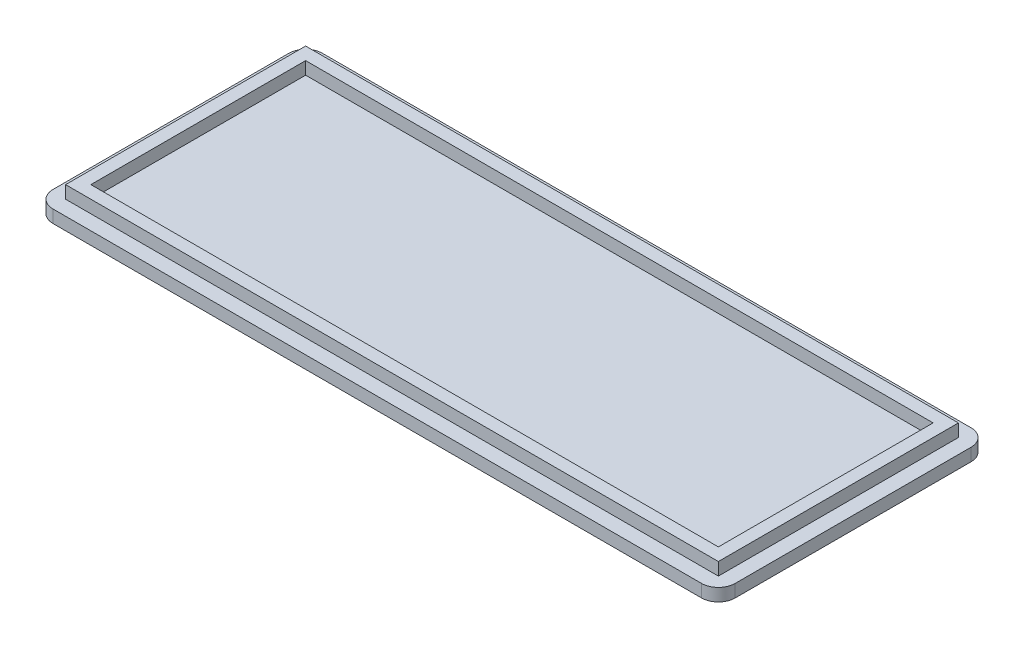
ISO-10303-21;
HEADER;
FILE_DESCRIPTION(('STEP AP214'),'2;1');
FILE_NAME('part.step','',(''),(''),'','','');
FILE_SCHEMA(('AUTOMOTIVE_DESIGN { 1 0 10303 214 1 1 1 1 }'));
ENDSEC;
DATA;
#1=APPLICATION_CONTEXT('core data for automotive mechanical design processes');
#2=APPLICATION_PROTOCOL_DEFINITION('international standard','automotive_design',2000,#1);
#3=PRODUCT_CONTEXT('',#1,'mechanical');
#4=PRODUCT('Part','Part','',(#3));
#5=PRODUCT_RELATED_PRODUCT_CATEGORY('part','',(#4));
#6=PRODUCT_DEFINITION_FORMATION('','',#4);
#7=PRODUCT_DEFINITION_CONTEXT('part definition',#1,'design');
#8=PRODUCT_DEFINITION('design','',#6,#7);
#9=PRODUCT_DEFINITION_SHAPE('','',#8);
#10=(LENGTH_UNIT() NAMED_UNIT(*) SI_UNIT(.MILLI.,.METRE.));
#11=(NAMED_UNIT(*) PLANE_ANGLE_UNIT() SI_UNIT($,.RADIAN.));
#12=(NAMED_UNIT(*) SI_UNIT($,.STERADIAN.) SOLID_ANGLE_UNIT());
#13=UNCERTAINTY_MEASURE_WITH_UNIT(LENGTH_MEASURE(1.E-05),#10,'distance_accuracy_value','');
#14=(GEOMETRIC_REPRESENTATION_CONTEXT(3) GLOBAL_UNCERTAINTY_ASSIGNED_CONTEXT((#13)) GLOBAL_UNIT_ASSIGNED_CONTEXT((#10,
#11,#12)) REPRESENTATION_CONTEXT('',''));
#15=CARTESIAN_POINT('',(0.,0.,0.));
#16=DIRECTION('',(0.,0.,1.));
#17=DIRECTION('',(1.,0.,0.));
#18=AXIS2_PLACEMENT_3D('',#15,#16,#17);
#19=CARTESIAN_POINT('',(-76.5468975214648,1.5,84.2907887061209));
#20=DIRECTION('',(0.,1.,0.));
#21=DIRECTION('',(0.,0.,1.));
#22=AXIS2_PLACEMENT_3D('',#19,#20,#21);
#23=PLANE('',#22);
#24=CARTESIAN_POINT('',(-76.5468975214648,1.5,84.2907887061209));
#25=DIRECTION('',(0.,1.,0.));
#26=DIRECTION('',(0.,0.,1.));
#27=AXIS2_PLACEMENT_3D('',#24,#25,#26);
#28=CIRCLE('',#27,2.);
#29=CARTESIAN_POINT('',(-76.5468975214649,1.5,86.2907887061209));
#30=VERTEX_POINT('',#29);
#31=CARTESIAN_POINT('',(-74.5468975214648,1.5,84.2907887061209));
#32=VERTEX_POINT('',#31);
#33=EDGE_CURVE('E214',#30,#32,#28,.T.);
#34=ORIENTED_EDGE('',*,*,#33,.T.);
#35=DIRECTION('',(0.,0.,-1.));
#36=VECTOR('',#35,1.);
#37=CARTESIAN_POINT('',(-74.5468975214648,1.5,84.2907887061209));
#38=LINE('',#37,#36);
#39=CARTESIAN_POINT('',(-74.5468975214648,1.5,56.2907887061209));
#40=VERTEX_POINT('',#39);
#41=EDGE_CURVE('E217',#32,#40,#38,.T.);
#42=ORIENTED_EDGE('',*,*,#41,.T.);
#43=CARTESIAN_POINT('',(-76.5468975214648,1.5,56.2907887061209));
#44=DIRECTION('',(0.,1.,0.));
#45=DIRECTION('',(0.,0.,1.));
#46=AXIS2_PLACEMENT_3D('',#43,#44,#45);
#47=CIRCLE('',#46,2.);
#48=CARTESIAN_POINT('',(-76.5468975214649,1.5,54.2907887061209));
#49=VERTEX_POINT('',#48);
#50=EDGE_CURVE('E220',#40,#49,#47,.T.);
#51=ORIENTED_EDGE('',*,*,#50,.T.);
#52=DIRECTION('',(-1.,0.,0.));
#53=VECTOR('',#52,1.);
#54=CARTESIAN_POINT('',(-76.5468975214649,1.5,54.2907887061209));
#55=LINE('',#54,#53);
#56=CARTESIAN_POINT('',(-153.546897521465,1.5,54.2907887061209));
#57=VERTEX_POINT('',#56);
#58=EDGE_CURVE('E222',#49,#57,#55,.T.);
#59=ORIENTED_EDGE('',*,*,#58,.T.);
#60=CARTESIAN_POINT('',(-153.546897521465,1.5,56.2907887061209));
#61=DIRECTION('',(0.,1.,0.));
#62=DIRECTION('',(0.,0.,1.));
#63=AXIS2_PLACEMENT_3D('',#60,#61,#62);
#64=CIRCLE('',#63,2.);
#65=CARTESIAN_POINT('',(-155.546897521465,1.5,56.290788706121));
#66=VERTEX_POINT('',#65);
#67=EDGE_CURVE('E224',#57,#66,#64,.T.);
#68=ORIENTED_EDGE('',*,*,#67,.T.);
#69=DIRECTION('',(0.,0.,1.));
#70=VECTOR('',#69,1.);
#71=CARTESIAN_POINT('',(-155.546897521465,1.5,84.2907887061209));
#72=LINE('',#71,#70);
#73=CARTESIAN_POINT('',(-155.546897521465,1.5,84.2907887061209));
#74=VERTEX_POINT('',#73);
#75=EDGE_CURVE('E226',#66,#74,#72,.T.);
#76=ORIENTED_EDGE('',*,*,#75,.T.);
#77=CARTESIAN_POINT('',(-153.546897521465,1.5,84.2907887061209));
#78=DIRECTION('',(0.,1.,0.));
#79=DIRECTION('',(0.,0.,-1.));
#80=AXIS2_PLACEMENT_3D('',#77,#78,#79);
#81=CIRCLE('',#80,2.);
#82=CARTESIAN_POINT('',(-153.546897521465,1.5,86.2907887061209));
#83=VERTEX_POINT('',#82);
#84=EDGE_CURVE('E228',#74,#83,#81,.T.);
#85=ORIENTED_EDGE('',*,*,#84,.T.);
#86=DIRECTION('',(1.,0.,0.));
#87=VECTOR('',#86,1.);
#88=CARTESIAN_POINT('',(-76.5468975214649,1.5,86.2907887061209));
#89=LINE('',#88,#87);
#90=EDGE_CURVE('E230',#83,#30,#89,.T.);
#91=ORIENTED_EDGE('',*,*,#90,.T.);
#92=EDGE_LOOP('',(#34,#42,#51,#59,#68,#76,#85,#91));
#93=FACE_BOUND('',#92,.T.);
#94=DIRECTION('',(1.,0.,0.));
#95=VECTOR('',#94,1.);
#96=CARTESIAN_POINT('',(-153.796897521465,1.5,84.5407887061209));
#97=LINE('',#96,#95);
#98=CARTESIAN_POINT('',(-153.796897521465,1.5,84.5407887061209));
#99=VERTEX_POINT('',#98);
#100=CARTESIAN_POINT('',(-76.2968975214648,1.5,84.5407887061209));
#101=VERTEX_POINT('',#100);
#102=EDGE_CURVE('E200',#99,#101,#97,.T.);
#103=ORIENTED_EDGE('',*,*,#102,.F.);
#104=DIRECTION('',(0.,0.,1.));
#105=VECTOR('',#104,1.);
#106=CARTESIAN_POINT('',(-153.796897521465,1.5,56.0407887061209));
#107=LINE('',#106,#105);
#108=CARTESIAN_POINT('',(-153.796897521465,1.5,56.0407887061209));
#109=VERTEX_POINT('',#108);
#110=EDGE_CURVE('E165',#109,#99,#107,.T.);
#111=ORIENTED_EDGE('',*,*,#110,.F.);
#112=DIRECTION('',(-1.,0.,0.));
#113=VECTOR('',#112,1.);
#114=CARTESIAN_POINT('',(-153.796897521465,1.5,56.0407887061209));
#115=LINE('',#114,#113);
#116=CARTESIAN_POINT('',(-76.2968975214648,1.5,56.0407887061209));
#117=VERTEX_POINT('',#116);
#118=EDGE_CURVE('E191',#117,#109,#115,.T.);
#119=ORIENTED_EDGE('',*,*,#118,.F.);
#120=DIRECTION('',(0.,0.,-1.));
#121=VECTOR('',#120,1.);
#122=CARTESIAN_POINT('',(-76.2968975214648,1.5,56.0407887061209));
#123=LINE('',#122,#121);
#124=EDGE_CURVE('E202',#101,#117,#123,.T.);
#125=ORIENTED_EDGE('',*,*,#124,.F.);
#126=EDGE_LOOP('',(#103,#111,#119,#125));
#127=FACE_BOUND('',#126,.T.);
#128=ADVANCED_FACE('F33',(#93,#127),#23,.T.);
#129=CARTESIAN_POINT('',(-76.5468975214648,1.5,84.2907887061209));
#130=DIRECTION('',(0.,-1.,0.));
#131=DIRECTION('',(0.,0.,-1.));
#132=AXIS2_PLACEMENT_3D('',#129,#130,#131);
#133=CYLINDRICAL_SURFACE('',#132,2.);
#134=CARTESIAN_POINT('',(-76.5468975214648,0.,84.2907887061209));
#135=DIRECTION('',(0.,1.,0.));
#136=DIRECTION('',(0.,0.,1.));
#137=AXIS2_PLACEMENT_3D('',#134,#135,#136);
#138=CIRCLE('',#137,2.);
#139=CARTESIAN_POINT('',(-76.5468975214649,0.,86.2907887061209));
#140=VERTEX_POINT('',#139);
#141=CARTESIAN_POINT('',(-74.5468975214648,0.,84.2907887061209));
#142=VERTEX_POINT('',#141);
#143=EDGE_CURVE('E213',#140,#142,#138,.T.);
#144=ORIENTED_EDGE('',*,*,#143,.T.);
#145=DIRECTION('',(0.,-1.,0.));
#146=VECTOR('',#145,1.);
#147=CARTESIAN_POINT('',(-74.5468975214648,1.5,84.2907887061209));
#148=LINE('',#147,#146);
#149=EDGE_CURVE('E11',#32,#142,#148,.T.);
#150=ORIENTED_EDGE('',*,*,#149,.F.);
#151=ORIENTED_EDGE('',*,*,#33,.F.);
#152=DIRECTION('',(0.,-1.,0.));
#153=VECTOR('',#152,1.);
#154=CARTESIAN_POINT('',(-76.5468975214649,1.5,86.2907887061209));
#155=LINE('',#154,#153);
#156=EDGE_CURVE('E232',#30,#140,#155,.T.);
#157=ORIENTED_EDGE('',*,*,#156,.T.);
#158=EDGE_LOOP('',(#144,#150,#151,#157));
#159=FACE_BOUND('',#158,.T.);
#160=ADVANCED_FACE('F35',(#159),#133,.T.);
#161=CARTESIAN_POINT('',(-74.5468975214648,1.5,84.2907887061209));
#162=DIRECTION('',(-1.,0.,0.));
#163=DIRECTION('',(0.,0.,1.));
#164=AXIS2_PLACEMENT_3D('',#161,#162,#163);
#165=PLANE('',#164);
#166=DIRECTION('',(0.,0.,-1.));
#167=VECTOR('',#166,1.);
#168=CARTESIAN_POINT('',(-74.5468975214648,0.,84.2907887061209));
#169=LINE('',#168,#167);
#170=CARTESIAN_POINT('',(-74.5468975214648,0.,56.2907887061209));
#171=VERTEX_POINT('',#170);
#172=EDGE_CURVE('E235',#142,#171,#169,.T.);
#173=ORIENTED_EDGE('',*,*,#172,.T.);
#174=DIRECTION('',(0.,-1.,0.));
#175=VECTOR('',#174,1.);
#176=CARTESIAN_POINT('',(-74.5468975214648,1.5,56.2907887061209));
#177=LINE('',#176,#175);
#178=EDGE_CURVE('E41',#40,#171,#177,.T.);
#179=ORIENTED_EDGE('',*,*,#178,.F.);
#180=ORIENTED_EDGE('',*,*,#41,.F.);
#181=ORIENTED_EDGE('',*,*,#149,.T.);
#182=EDGE_LOOP('',(#173,#179,#180,#181));
#183=FACE_BOUND('',#182,.T.);
#184=ADVANCED_FACE('F292',(#183),#165,.F.);
#185=CARTESIAN_POINT('',(-76.5468975214648,1.5,56.2907887061209));
#186=DIRECTION('',(0.,-1.,0.));
#187=DIRECTION('',(0.,0.,-1.));
#188=AXIS2_PLACEMENT_3D('',#185,#186,#187);
#189=CYLINDRICAL_SURFACE('',#188,2.);
#190=CARTESIAN_POINT('',(-76.5468975214648,0.,56.2907887061209));
#191=DIRECTION('',(0.,1.,0.));
#192=DIRECTION('',(0.,0.,1.));
#193=AXIS2_PLACEMENT_3D('',#190,#191,#192);
#194=CIRCLE('',#193,2.);
#195=CARTESIAN_POINT('',(-76.5468975214649,0.,54.2907887061209));
#196=VERTEX_POINT('',#195);
#197=EDGE_CURVE('E237',#171,#196,#194,.T.);
#198=ORIENTED_EDGE('',*,*,#197,.T.);
#199=DIRECTION('',(0.,-1.,0.));
#200=VECTOR('',#199,1.);
#201=CARTESIAN_POINT('',(-76.5468975214649,1.5,54.2907887061209));
#202=LINE('',#201,#200);
#203=EDGE_CURVE('E262',#49,#196,#202,.T.);
#204=ORIENTED_EDGE('',*,*,#203,.F.);
#205=ORIENTED_EDGE('',*,*,#50,.F.);
#206=ORIENTED_EDGE('',*,*,#178,.T.);
#207=EDGE_LOOP('',(#198,#204,#205,#206));
#208=FACE_BOUND('',#207,.T.);
#209=ADVANCED_FACE('F269',(#208),#189,.T.);
#210=CARTESIAN_POINT('',(-76.5468975214649,1.5,54.2907887061209));
#211=DIRECTION('',(0.,0.,1.));
#212=DIRECTION('',(1.,0.,0.));
#213=AXIS2_PLACEMENT_3D('',#210,#211,#212);
#214=PLANE('',#213);
#215=DIRECTION('',(-1.,0.,0.));
#216=VECTOR('',#215,1.);
#217=CARTESIAN_POINT('',(-76.5468975214649,0.,54.2907887061209));
#218=LINE('',#217,#216);
#219=CARTESIAN_POINT('',(-153.546897521465,0.,54.2907887061209));
#220=VERTEX_POINT('',#219);
#221=EDGE_CURVE('E239',#196,#220,#218,.T.);
#222=ORIENTED_EDGE('',*,*,#221,.T.);
#223=DIRECTION('',(0.,-1.,0.));
#224=VECTOR('',#223,1.);
#225=CARTESIAN_POINT('',(-153.546897521465,1.5,54.2907887061209));
#226=LINE('',#225,#224);
#227=EDGE_CURVE('E259',#57,#220,#226,.T.);
#228=ORIENTED_EDGE('',*,*,#227,.F.);
#229=ORIENTED_EDGE('',*,*,#58,.F.);
#230=ORIENTED_EDGE('',*,*,#203,.T.);
#231=EDGE_LOOP('',(#222,#228,#229,#230));
#232=FACE_BOUND('',#231,.T.);
#233=ADVANCED_FACE('F280',(#232),#214,.F.);
#234=CARTESIAN_POINT('',(-153.546897521465,1.5,56.2907887061209));
#235=DIRECTION('',(0.,-1.,0.));
#236=DIRECTION('',(0.,0.,-1.));
#237=AXIS2_PLACEMENT_3D('',#234,#235,#236);
#238=CYLINDRICAL_SURFACE('',#237,2.);
#239=CARTESIAN_POINT('',(-153.546897521465,0.,56.2907887061209));
#240=DIRECTION('',(0.,1.,0.));
#241=DIRECTION('',(0.,0.,1.));
#242=AXIS2_PLACEMENT_3D('',#239,#240,#241);
#243=CIRCLE('',#242,2.);
#244=CARTESIAN_POINT('',(-155.546897521465,0.,56.290788706121));
#245=VERTEX_POINT('',#244);
#246=EDGE_CURVE('E241',#220,#245,#243,.T.);
#247=ORIENTED_EDGE('',*,*,#246,.T.);
#248=DIRECTION('',(0.,-1.,0.));
#249=VECTOR('',#248,1.);
#250=CARTESIAN_POINT('',(-155.546897521465,1.5,56.290788706121));
#251=LINE('',#250,#249);
#252=EDGE_CURVE('E256',#66,#245,#251,.T.);
#253=ORIENTED_EDGE('',*,*,#252,.F.);
#254=ORIENTED_EDGE('',*,*,#67,.F.);
#255=ORIENTED_EDGE('',*,*,#227,.T.);
#256=EDGE_LOOP('',(#247,#253,#254,#255));
#257=FACE_BOUND('',#256,.T.);
#258=ADVANCED_FACE('F284',(#257),#238,.T.);
#259=CARTESIAN_POINT('',(-155.546897521465,1.5,84.2907887061209));
#260=DIRECTION('',(1.,0.,0.));
#261=DIRECTION('',(0.,0.,-1.));
#262=AXIS2_PLACEMENT_3D('',#259,#260,#261);
#263=PLANE('',#262);
#264=DIRECTION('',(0.,0.,1.));
#265=VECTOR('',#264,1.);
#266=CARTESIAN_POINT('',(-155.546897521465,0.,84.2907887061209));
#267=LINE('',#266,#265);
#268=CARTESIAN_POINT('',(-155.546897521465,0.,84.2907887061209));
#269=VERTEX_POINT('',#268);
#270=EDGE_CURVE('E243',#245,#269,#267,.T.);
#271=ORIENTED_EDGE('',*,*,#270,.T.);
#272=DIRECTION('',(0.,-1.,0.));
#273=VECTOR('',#272,1.);
#274=CARTESIAN_POINT('',(-155.546897521465,1.5,84.2907887061209));
#275=LINE('',#274,#273);
#276=EDGE_CURVE('E253',#74,#269,#275,.T.);
#277=ORIENTED_EDGE('',*,*,#276,.F.);
#278=ORIENTED_EDGE('',*,*,#75,.F.);
#279=ORIENTED_EDGE('',*,*,#252,.T.);
#280=EDGE_LOOP('',(#271,#277,#278,#279));
#281=FACE_BOUND('',#280,.T.);
#282=ADVANCED_FACE('F305',(#281),#263,.F.);
#283=CARTESIAN_POINT('',(-153.546897521465,1.5,84.2907887061209));
#284=DIRECTION('',(0.,-1.,0.));
#285=DIRECTION('',(0.,0.,-1.));
#286=AXIS2_PLACEMENT_3D('',#283,#284,#285);
#287=CYLINDRICAL_SURFACE('',#286,2.);
#288=CARTESIAN_POINT('',(-153.546897521465,0.,84.2907887061209));
#289=DIRECTION('',(0.,1.,0.));
#290=DIRECTION('',(0.,0.,-1.));
#291=AXIS2_PLACEMENT_3D('',#288,#289,#290);
#292=CIRCLE('',#291,2.);
#293=CARTESIAN_POINT('',(-153.546897521465,0.,86.2907887061209));
#294=VERTEX_POINT('',#293);
#295=EDGE_CURVE('E245',#269,#294,#292,.T.);
#296=ORIENTED_EDGE('',*,*,#295,.T.);
#297=DIRECTION('',(0.,-1.,0.));
#298=VECTOR('',#297,1.);
#299=CARTESIAN_POINT('',(-153.546897521465,1.5,86.2907887061209));
#300=LINE('',#299,#298);
#301=EDGE_CURVE('E250',#83,#294,#300,.T.);
#302=ORIENTED_EDGE('',*,*,#301,.F.);
#303=ORIENTED_EDGE('',*,*,#84,.F.);
#304=ORIENTED_EDGE('',*,*,#276,.T.);
#305=EDGE_LOOP('',(#296,#302,#303,#304));
#306=FACE_BOUND('',#305,.T.);
#307=ADVANCED_FACE('F303',(#306),#287,.T.);
#308=CARTESIAN_POINT('',(-76.5468975214649,1.5,86.2907887061209));
#309=DIRECTION('',(0.,0.,-1.));
#310=DIRECTION('',(-1.,0.,0.));
#311=AXIS2_PLACEMENT_3D('',#308,#309,#310);
#312=PLANE('',#311);
#313=DIRECTION('',(1.,0.,0.));
#314=VECTOR('',#313,1.);
#315=CARTESIAN_POINT('',(-76.5468975214649,0.,86.2907887061209));
#316=LINE('',#315,#314);
#317=EDGE_CURVE('E218',#294,#140,#316,.T.);
#318=ORIENTED_EDGE('',*,*,#317,.T.);
#319=ORIENTED_EDGE('',*,*,#156,.F.);
#320=ORIENTED_EDGE('',*,*,#90,.F.);
#321=ORIENTED_EDGE('',*,*,#301,.T.);
#322=EDGE_LOOP('',(#318,#319,#320,#321));
#323=FACE_BOUND('',#322,.T.);
#324=ADVANCED_FACE('F298',(#323),#312,.F.);
#325=CARTESIAN_POINT('',(-76.5468975214648,0.,84.2907887061209));
#326=DIRECTION('',(0.,1.,0.));
#327=DIRECTION('',(0.,0.,1.));
#328=AXIS2_PLACEMENT_3D('',#325,#326,#327);
#329=PLANE('',#328);
#330=ORIENTED_EDGE('',*,*,#143,.F.);
#331=ORIENTED_EDGE('',*,*,#317,.F.);
#332=ORIENTED_EDGE('',*,*,#295,.F.);
#333=ORIENTED_EDGE('',*,*,#270,.F.);
#334=ORIENTED_EDGE('',*,*,#246,.F.);
#335=ORIENTED_EDGE('',*,*,#221,.F.);
#336=ORIENTED_EDGE('',*,*,#197,.F.);
#337=ORIENTED_EDGE('',*,*,#172,.F.);
#338=EDGE_LOOP('',(#330,#331,#332,#333,#334,#335,#336,#337));
#339=FACE_BOUND('',#338,.T.);
#340=ADVANCED_FACE('F275',(#339),#329,.F.);
#341=CARTESIAN_POINT('',(0.,3.,0.));
#342=DIRECTION('',(0.,1.,0.));
#343=DIRECTION('',(0.,0.,1.));
#344=AXIS2_PLACEMENT_3D('',#341,#342,#343);
#345=PLANE('',#344);
#346=DIRECTION('',(0.,0.,1.));
#347=VECTOR('',#346,1.);
#348=CARTESIAN_POINT('',(-153.796897521465,3.,56.0407887061209));
#349=LINE('',#348,#347);
#350=CARTESIAN_POINT('',(-153.796897521465,3.,56.0407887061209));
#351=VERTEX_POINT('',#350);
#352=CARTESIAN_POINT('',(-153.796897521465,3.,84.5407887061209));
#353=VERTEX_POINT('',#352);
#354=EDGE_CURVE('E187',#351,#353,#349,.T.);
#355=ORIENTED_EDGE('',*,*,#354,.T.);
#356=DIRECTION('',(1.,0.,0.));
#357=VECTOR('',#356,1.);
#358=CARTESIAN_POINT('',(-153.796897521465,3.,84.5407887061209));
#359=LINE('',#358,#357);
#360=CARTESIAN_POINT('',(-76.2968975214648,3.,84.5407887061209));
#361=VERTEX_POINT('',#360);
#362=EDGE_CURVE('E190',#353,#361,#359,.T.);
#363=ORIENTED_EDGE('',*,*,#362,.T.);
#364=DIRECTION('',(0.,0.,-1.));
#365=VECTOR('',#364,1.);
#366=CARTESIAN_POINT('',(-76.2968975214648,3.,56.0407887061209));
#367=LINE('',#366,#365);
#368=CARTESIAN_POINT('',(-76.2968975214648,3.,56.0407887061209));
#369=VERTEX_POINT('',#368);
#370=EDGE_CURVE('E193',#361,#369,#367,.T.);
#371=ORIENTED_EDGE('',*,*,#370,.T.);
#372=DIRECTION('',(-1.,0.,0.));
#373=VECTOR('',#372,1.);
#374=CARTESIAN_POINT('',(-153.796897521465,3.,56.0407887061209));
#375=LINE('',#374,#373);
#376=EDGE_CURVE('E195',#369,#351,#375,.T.);
#377=ORIENTED_EDGE('',*,*,#376,.T.);
#378=EDGE_LOOP('',(#355,#363,#371,#377));
#379=FACE_BOUND('',#378,.T.);
#380=DIRECTION('',(1.,0.,0.));
#381=VECTOR('',#380,1.);
#382=CARTESIAN_POINT('',(-152.296897521465,3.,83.0407887061209));
#383=LINE('',#382,#381);
#384=CARTESIAN_POINT('',(-152.296897521465,3.,83.0407887061209));
#385=VERTEX_POINT('',#384);
#386=CARTESIAN_POINT('',(-77.7968975214648,3.,83.0407887061209));
#387=VERTEX_POINT('',#386);
#388=EDGE_CURVE('E157',#385,#387,#383,.T.);
#389=ORIENTED_EDGE('',*,*,#388,.F.);
#390=DIRECTION('',(0.,0.,1.));
#391=VECTOR('',#390,1.);
#392=CARTESIAN_POINT('',(-152.296897521465,3.,57.5407887061209));
#393=LINE('',#392,#391);
#394=CARTESIAN_POINT('',(-152.296897521465,3.,57.5407887061209));
#395=VERTEX_POINT('',#394);
#396=EDGE_CURVE('E148',#395,#385,#393,.T.);
#397=ORIENTED_EDGE('',*,*,#396,.F.);
#398=DIRECTION('',(-1.,0.,0.));
#399=VECTOR('',#398,1.);
#400=CARTESIAN_POINT('',(-152.296897521465,3.,57.5407887061209));
#401=LINE('',#400,#399);
#402=CARTESIAN_POINT('',(-77.7968975214648,3.,57.5407887061209));
#403=VERTEX_POINT('',#402);
#404=EDGE_CURVE('E173',#403,#395,#401,.T.);
#405=ORIENTED_EDGE('',*,*,#404,.F.);
#406=DIRECTION('',(0.,0.,-1.));
#407=VECTOR('',#406,1.);
#408=CARTESIAN_POINT('',(-77.7968975214648,3.,57.5407887061209));
#409=LINE('',#408,#407);
#410=EDGE_CURVE('E171',#387,#403,#409,.T.);
#411=ORIENTED_EDGE('',*,*,#410,.F.);
#412=EDGE_LOOP('',(#389,#397,#405,#411));
#413=FACE_BOUND('',#412,.T.);
#414=ADVANCED_FACE('F169',(#379,#413),#345,.T.);
#415=CARTESIAN_POINT('',(-153.796897521465,3.,56.0407887061209));
#416=DIRECTION('',(1.,0.,0.));
#417=DIRECTION('',(0.,0.,-1.));
#418=AXIS2_PLACEMENT_3D('',#415,#416,#417);
#419=PLANE('',#418);
#420=ORIENTED_EDGE('',*,*,#110,.T.);
#421=DIRECTION('',(0.,-1.,0.));
#422=VECTOR('',#421,1.);
#423=CARTESIAN_POINT('',(-153.796897521465,3.,84.5407887061209));
#424=LINE('',#423,#422);
#425=EDGE_CURVE('E211',#353,#99,#424,.T.);
#426=ORIENTED_EDGE('',*,*,#425,.F.);
#427=ORIENTED_EDGE('',*,*,#354,.F.);
#428=DIRECTION('',(0.,-1.,0.));
#429=VECTOR('',#428,1.);
#430=CARTESIAN_POINT('',(-153.796897521465,3.,56.0407887061209));
#431=LINE('',#430,#429);
#432=EDGE_CURVE('E197',#351,#109,#431,.T.);
#433=ORIENTED_EDGE('',*,*,#432,.T.);
#434=EDGE_LOOP('',(#420,#426,#427,#433));
#435=FACE_BOUND('',#434,.T.);
#436=ADVANCED_FACE('F344',(#435),#419,.F.);
#437=CARTESIAN_POINT('',(-153.796897521465,3.,84.5407887061209));
#438=DIRECTION('',(0.,0.,-1.));
#439=DIRECTION('',(-1.,0.,0.));
#440=AXIS2_PLACEMENT_3D('',#437,#438,#439);
#441=PLANE('',#440);
#442=ORIENTED_EDGE('',*,*,#102,.T.);
#443=DIRECTION('',(0.,-1.,0.));
#444=VECTOR('',#443,1.);
#445=CARTESIAN_POINT('',(-76.2968975214648,3.,84.5407887061209));
#446=LINE('',#445,#444);
#447=EDGE_CURVE('E208',#361,#101,#446,.T.);
#448=ORIENTED_EDGE('',*,*,#447,.F.);
#449=ORIENTED_EDGE('',*,*,#362,.F.);
#450=ORIENTED_EDGE('',*,*,#425,.T.);
#451=EDGE_LOOP('',(#442,#448,#449,#450));
#452=FACE_BOUND('',#451,.T.);
#453=ADVANCED_FACE('F351',(#452),#441,.F.);
#454=CARTESIAN_POINT('',(-76.2968975214648,3.,56.0407887061209));
#455=DIRECTION('',(-1.,0.,0.));
#456=DIRECTION('',(0.,0.,1.));
#457=AXIS2_PLACEMENT_3D('',#454,#455,#456);
#458=PLANE('',#457);
#459=ORIENTED_EDGE('',*,*,#124,.T.);
#460=DIRECTION('',(0.,-1.,0.));
#461=VECTOR('',#460,1.);
#462=CARTESIAN_POINT('',(-76.2968975214648,3.,56.0407887061209));
#463=LINE('',#462,#461);
#464=EDGE_CURVE('E48',#369,#117,#463,.T.);
#465=ORIENTED_EDGE('',*,*,#464,.F.);
#466=ORIENTED_EDGE('',*,*,#370,.F.);
#467=ORIENTED_EDGE('',*,*,#447,.T.);
#468=EDGE_LOOP('',(#459,#465,#466,#467));
#469=FACE_BOUND('',#468,.T.);
#470=ADVANCED_FACE('F348',(#469),#458,.F.);
#471=CARTESIAN_POINT('',(-153.796897521465,3.,56.0407887061209));
#472=DIRECTION('',(0.,0.,1.));
#473=DIRECTION('',(1.,0.,0.));
#474=AXIS2_PLACEMENT_3D('',#471,#472,#473);
#475=PLANE('',#474);
#476=ORIENTED_EDGE('',*,*,#118,.T.);
#477=ORIENTED_EDGE('',*,*,#432,.F.);
#478=ORIENTED_EDGE('',*,*,#376,.F.);
#479=ORIENTED_EDGE('',*,*,#464,.T.);
#480=EDGE_LOOP('',(#476,#477,#478,#479));
#481=FACE_BOUND('',#480,.T.);
#482=ADVANCED_FACE('F341',(#481),#475,.F.);
#483=CARTESIAN_POINT('',(-152.296897521465,3.,57.5407887061209));
#484=DIRECTION('',(1.,0.,0.));
#485=DIRECTION('',(0.,0.,-1.));
#486=AXIS2_PLACEMENT_3D('',#483,#484,#485);
#487=PLANE('',#486);
#488=DIRECTION('',(0.,0.,1.));
#489=VECTOR('',#488,1.);
#490=CARTESIAN_POINT('',(-152.296897521465,1.5,57.5407887061209));
#491=LINE('',#490,#489);
#492=CARTESIAN_POINT('',(-152.296897521465,1.5,57.5407887061209));
#493=VERTEX_POINT('',#492);
#494=CARTESIAN_POINT('',(-152.296897521465,1.5,83.0407887061209));
#495=VERTEX_POINT('',#494);
#496=EDGE_CURVE('E56',#493,#495,#491,.T.);
#497=ORIENTED_EDGE('',*,*,#496,.F.);
#498=DIRECTION('',(0.,-1.,0.));
#499=VECTOR('',#498,1.);
#500=CARTESIAN_POINT('',(-152.296897521465,3.,57.5407887061209));
#501=LINE('',#500,#499);
#502=EDGE_CURVE('E153',#395,#493,#501,.T.);
#503=ORIENTED_EDGE('',*,*,#502,.F.);
#504=ORIENTED_EDGE('',*,*,#396,.T.);
#505=DIRECTION('',(0.,-1.,0.));
#506=VECTOR('',#505,1.);
#507=CARTESIAN_POINT('',(-152.296897521465,3.,83.0407887061209));
#508=LINE('',#507,#506);
#509=EDGE_CURVE('E151',#385,#495,#508,.T.);
#510=ORIENTED_EDGE('',*,*,#509,.T.);
#511=EDGE_LOOP('',(#497,#503,#504,#510));
#512=FACE_BOUND('',#511,.T.);
#513=ADVANCED_FACE('F150',(#512),#487,.T.);
#514=CARTESIAN_POINT('',(-152.296897521465,3.,83.0407887061209));
#515=DIRECTION('',(0.,0.,-1.));
#516=DIRECTION('',(-1.,0.,0.));
#517=AXIS2_PLACEMENT_3D('',#514,#515,#516);
#518=PLANE('',#517);
#519=DIRECTION('',(1.,0.,0.));
#520=VECTOR('',#519,1.);
#521=CARTESIAN_POINT('',(-152.296897521465,1.5,83.0407887061209));
#522=LINE('',#521,#520);
#523=CARTESIAN_POINT('',(-77.7968975214648,1.5,83.0407887061209));
#524=VERTEX_POINT('',#523);
#525=EDGE_CURVE('E164',#495,#524,#522,.T.);
#526=ORIENTED_EDGE('',*,*,#525,.F.);
#527=ORIENTED_EDGE('',*,*,#509,.F.);
#528=ORIENTED_EDGE('',*,*,#388,.T.);
#529=DIRECTION('',(0.,-1.,0.));
#530=VECTOR('',#529,1.);
#531=CARTESIAN_POINT('',(-77.7968975214648,3.,83.0407887061209));
#532=LINE('',#531,#530);
#533=EDGE_CURVE('E166',#387,#524,#532,.T.);
#534=ORIENTED_EDGE('',*,*,#533,.T.);
#535=EDGE_LOOP('',(#526,#527,#528,#534));
#536=FACE_BOUND('',#535,.T.);
#537=ADVANCED_FACE('F161',(#536),#518,.T.);
#538=CARTESIAN_POINT('',(-77.7968975214648,3.,57.5407887061209));
#539=DIRECTION('',(-1.,0.,0.));
#540=DIRECTION('',(0.,0.,1.));
#541=AXIS2_PLACEMENT_3D('',#538,#539,#540);
#542=PLANE('',#541);
#543=DIRECTION('',(0.,0.,-1.));
#544=VECTOR('',#543,1.);
#545=CARTESIAN_POINT('',(-77.7968975214648,1.5,57.5407887061209));
#546=LINE('',#545,#544);
#547=CARTESIAN_POINT('',(-77.7968975214648,1.5,57.5407887061209));
#548=VERTEX_POINT('',#547);
#549=EDGE_CURVE('E179',#524,#548,#546,.T.);
#550=ORIENTED_EDGE('',*,*,#549,.F.);
#551=ORIENTED_EDGE('',*,*,#533,.F.);
#552=ORIENTED_EDGE('',*,*,#410,.T.);
#553=DIRECTION('',(0.,-1.,0.));
#554=VECTOR('',#553,1.);
#555=CARTESIAN_POINT('',(-77.7968975214648,3.,57.5407887061209));
#556=LINE('',#555,#554);
#557=EDGE_CURVE('E183',#403,#548,#556,.T.);
#558=ORIENTED_EDGE('',*,*,#557,.T.);
#559=EDGE_LOOP('',(#550,#551,#552,#558));
#560=FACE_BOUND('',#559,.T.);
#561=ADVANCED_FACE('F327',(#560),#542,.T.);
#562=CARTESIAN_POINT('',(-152.296897521465,3.,57.5407887061209));
#563=DIRECTION('',(0.,0.,1.));
#564=DIRECTION('',(1.,0.,0.));
#565=AXIS2_PLACEMENT_3D('',#562,#563,#564);
#566=PLANE('',#565);
#567=DIRECTION('',(-1.,0.,0.));
#568=VECTOR('',#567,1.);
#569=CARTESIAN_POINT('',(-152.296897521465,1.5,57.5407887061209));
#570=LINE('',#569,#568);
#571=EDGE_CURVE('E158',#548,#493,#570,.T.);
#572=ORIENTED_EDGE('',*,*,#571,.F.);
#573=ORIENTED_EDGE('',*,*,#557,.F.);
#574=ORIENTED_EDGE('',*,*,#404,.T.);
#575=ORIENTED_EDGE('',*,*,#502,.T.);
#576=EDGE_LOOP('',(#572,#573,#574,#575));
#577=FACE_BOUND('',#576,.T.);
#578=ADVANCED_FACE('F323',(#577),#566,.T.);
#579=ORIENTED_EDGE('',*,*,#496,.T.);
#580=ORIENTED_EDGE('',*,*,#525,.T.);
#581=ORIENTED_EDGE('',*,*,#549,.T.);
#582=ORIENTED_EDGE('',*,*,#571,.T.);
#583=EDGE_LOOP('',(#579,#580,#581,#582));
#584=FACE_BOUND('',#583,.T.);
#585=ADVANCED_FACE('F316',(#584),#23,.T.);
#586=CLOSED_SHELL('',(#128,#160,#184,#209,#233,#258,#282,#307,#324,#340,#414,#436,#453,#470,
#482,#513,#537,#561,#578,#585));
#587=MANIFOLD_SOLID_BREP('B2',#586);
#588=ADVANCED_BREP_SHAPE_REPRESENTATION('',(#18,#587),#14);
#589=SHAPE_DEFINITION_REPRESENTATION(#9,#588);
ENDSEC;
END-ISO-10303-21;
